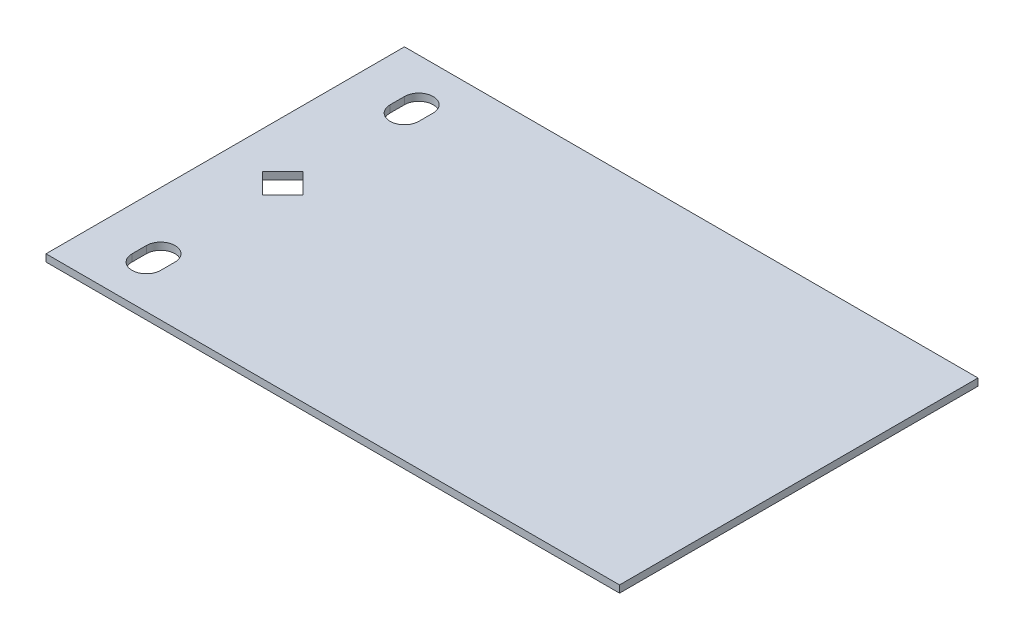
ISO-10303-21;
HEADER;
FILE_DESCRIPTION(('STEP AP214'),'2;1');
FILE_NAME('part.step','',(''),(''),'','','');
FILE_SCHEMA(('AUTOMOTIVE_DESIGN { 1 0 10303 214 1 1 1 1 }'));
ENDSEC;
DATA;
#1=APPLICATION_CONTEXT('core data for automotive mechanical design processes');
#2=APPLICATION_PROTOCOL_DEFINITION('international standard','automotive_design',2000,#1);
#3=PRODUCT_CONTEXT('',#1,'mechanical');
#4=PRODUCT('Part','Part','',(#3));
#5=PRODUCT_RELATED_PRODUCT_CATEGORY('part','',(#4));
#6=PRODUCT_DEFINITION_FORMATION('','',#4);
#7=PRODUCT_DEFINITION_CONTEXT('part definition',#1,'design');
#8=PRODUCT_DEFINITION('design','',#6,#7);
#9=PRODUCT_DEFINITION_SHAPE('','',#8);
#10=(LENGTH_UNIT() NAMED_UNIT(*) SI_UNIT(.MILLI.,.METRE.));
#11=(NAMED_UNIT(*) PLANE_ANGLE_UNIT() SI_UNIT($,.RADIAN.));
#12=(NAMED_UNIT(*) SI_UNIT($,.STERADIAN.) SOLID_ANGLE_UNIT());
#13=UNCERTAINTY_MEASURE_WITH_UNIT(LENGTH_MEASURE(1.E-05),#10,'distance_accuracy_value','');
#14=(GEOMETRIC_REPRESENTATION_CONTEXT(3) GLOBAL_UNCERTAINTY_ASSIGNED_CONTEXT((#13)) GLOBAL_UNIT_ASSIGNED_CONTEXT((#10,
#11,#12)) REPRESENTATION_CONTEXT('',''));
#15=CARTESIAN_POINT('',(0.,0.,0.));
#16=DIRECTION('',(0.,0.,1.));
#17=DIRECTION('',(1.,0.,0.));
#18=AXIS2_PLACEMENT_3D('',#15,#16,#17);
#19=CARTESIAN_POINT('',(0.,1.,0.));
#20=DIRECTION('',(0.,-1.,0.));
#21=DIRECTION('',(0.,0.,-1.));
#22=AXIS2_PLACEMENT_3D('',#19,#20,#21);
#23=PLANE('',#22);
#24=CARTESIAN_POINT('',(-32.,1.,19.));
#25=DIRECTION('',(0.,1.,0.));
#26=DIRECTION('',(0.,0.,1.));
#27=AXIS2_PLACEMENT_3D('',#24,#25,#26);
#28=CIRCLE('',#27,2.);
#29=CARTESIAN_POINT('',(-34.,1.,19.));
#30=VERTEX_POINT('',#29);
#31=CARTESIAN_POINT('',(-30.,1.,19.));
#32=VERTEX_POINT('',#31);
#33=EDGE_CURVE('E185',#30,#32,#28,.T.);
#34=ORIENTED_EDGE('',*,*,#33,.F.);
#35=DIRECTION('',(0.,0.,1.));
#36=VECTOR('',#35,1.);
#37=CARTESIAN_POINT('',(-34.,1.,19.));
#38=LINE('',#37,#36);
#39=CARTESIAN_POINT('',(-34.,1.,17.));
#40=VERTEX_POINT('',#39);
#41=EDGE_CURVE('E193',#40,#30,#38,.T.);
#42=ORIENTED_EDGE('',*,*,#41,.F.);
#43=CARTESIAN_POINT('',(-32.,1.,17.));
#44=DIRECTION('',(0.,1.,0.));
#45=DIRECTION('',(0.,0.,-1.));
#46=AXIS2_PLACEMENT_3D('',#43,#44,#45);
#47=CIRCLE('',#46,2.);
#48=CARTESIAN_POINT('',(-30.,1.,17.));
#49=VERTEX_POINT('',#48);
#50=EDGE_CURVE('E190',#49,#40,#47,.T.);
#51=ORIENTED_EDGE('',*,*,#50,.F.);
#52=DIRECTION('',(0.,0.,-1.));
#53=VECTOR('',#52,1.);
#54=CARTESIAN_POINT('',(-30.,1.,19.));
#55=LINE('',#54,#53);
#56=EDGE_CURVE('E187',#32,#49,#55,.T.);
#57=ORIENTED_EDGE('',*,*,#56,.F.);
#58=EDGE_LOOP('',(#34,#42,#51,#57));
#59=FACE_BOUND('',#58,.T.);
#60=DIRECTION('',(0.,0.,-1.));
#61=VECTOR('',#60,1.);
#62=CARTESIAN_POINT('',(40.,1.,25.));
#63=LINE('',#62,#61);
#64=CARTESIAN_POINT('',(40.,1.,25.));
#65=VERTEX_POINT('',#64);
#66=CARTESIAN_POINT('',(40.,1.,-25.));
#67=VERTEX_POINT('',#66);
#68=EDGE_CURVE('E247',#65,#67,#63,.T.);
#69=ORIENTED_EDGE('',*,*,#68,.T.);
#70=DIRECTION('',(-1.,0.,0.));
#71=VECTOR('',#70,1.);
#72=CARTESIAN_POINT('',(-40.,1.,-25.));
#73=LINE('',#72,#71);
#74=CARTESIAN_POINT('',(-40.,1.,-25.));
#75=VERTEX_POINT('',#74);
#76=EDGE_CURVE('E250',#67,#75,#73,.T.);
#77=ORIENTED_EDGE('',*,*,#76,.T.);
#78=DIRECTION('',(0.,0.,1.));
#79=VECTOR('',#78,1.);
#80=CARTESIAN_POINT('',(-40.,1.,25.));
#81=LINE('',#80,#79);
#82=CARTESIAN_POINT('',(-40.,1.,25.));
#83=VERTEX_POINT('',#82);
#84=EDGE_CURVE('E253',#75,#83,#81,.T.);
#85=ORIENTED_EDGE('',*,*,#84,.T.);
#86=DIRECTION('',(1.,0.,0.));
#87=VECTOR('',#86,1.);
#88=CARTESIAN_POINT('',(-40.,1.,25.));
#89=LINE('',#88,#87);
#90=EDGE_CURVE('E255',#83,#65,#89,.T.);
#91=ORIENTED_EDGE('',*,*,#90,.T.);
#92=EDGE_LOOP('',(#69,#77,#85,#91));
#93=FACE_BOUND('',#92,.T.);
#94=DIRECTION('',(-0.707106781186547,0.,0.707106781186548));
#95=VECTOR('',#94,1.);
#96=CARTESIAN_POINT('',(-32.,1.,-2.8284271247462));
#97=LINE('',#96,#95);
#98=CARTESIAN_POINT('',(-32.,1.,-2.8284271247462));
#99=VERTEX_POINT('',#98);
#100=CARTESIAN_POINT('',(-34.8284271247462,1.,0.));
#101=VERTEX_POINT('',#100);
#102=EDGE_CURVE('E216',#99,#101,#97,.T.);
#103=ORIENTED_EDGE('',*,*,#102,.F.);
#104=DIRECTION('',(-0.707106781186548,0.,-0.707106781186547));
#105=VECTOR('',#104,1.);
#106=CARTESIAN_POINT('',(-29.1715728752538,1.,0.));
#107=LINE('',#106,#105);
#108=CARTESIAN_POINT('',(-29.1715728752538,1.,0.));
#109=VERTEX_POINT('',#108);
#110=EDGE_CURVE('E224',#109,#99,#107,.T.);
#111=ORIENTED_EDGE('',*,*,#110,.F.);
#112=DIRECTION('',(0.707106781186548,0.,-0.707106781186547));
#113=VECTOR('',#112,1.);
#114=CARTESIAN_POINT('',(-32.,1.,2.82842712474619));
#115=LINE('',#114,#113);
#116=CARTESIAN_POINT('',(-32.,1.,2.82842712474619));
#117=VERTEX_POINT('',#116);
#118=EDGE_CURVE('E221',#117,#109,#115,.T.);
#119=ORIENTED_EDGE('',*,*,#118,.F.);
#120=DIRECTION('',(0.707106781186547,0.,0.707106781186548));
#121=VECTOR('',#120,1.);
#122=CARTESIAN_POINT('',(-34.8284271247462,1.,0.));
#123=LINE('',#122,#121);
#124=EDGE_CURVE('E218',#101,#117,#123,.T.);
#125=ORIENTED_EDGE('',*,*,#124,.F.);
#126=EDGE_LOOP('',(#103,#111,#119,#125));
#127=FACE_BOUND('',#126,.T.);
#128=CARTESIAN_POINT('',(-32.,1.,-19.));
#129=DIRECTION('',(0.,1.,0.));
#130=DIRECTION('',(0.,0.,-1.));
#131=AXIS2_PLACEMENT_3D('',#128,#129,#130);
#132=CIRCLE('',#131,2.);
#133=CARTESIAN_POINT('',(-30.,1.,-19.));
#134=VERTEX_POINT('',#133);
#135=CARTESIAN_POINT('',(-34.,1.,-19.));
#136=VERTEX_POINT('',#135);
#137=EDGE_CURVE('E149',#134,#136,#132,.T.);
#138=ORIENTED_EDGE('',*,*,#137,.F.);
#139=DIRECTION('',(0.,0.,-1.));
#140=VECTOR('',#139,1.);
#141=CARTESIAN_POINT('',(-30.,1.,-19.));
#142=LINE('',#141,#140);
#143=CARTESIAN_POINT('',(-30.,1.,-17.));
#144=VERTEX_POINT('',#143);
#145=EDGE_CURVE('E171',#144,#134,#142,.T.);
#146=ORIENTED_EDGE('',*,*,#145,.F.);
#147=CARTESIAN_POINT('',(-32.,1.,-17.));
#148=DIRECTION('',(0.,1.,0.));
#149=DIRECTION('',(0.,0.,1.));
#150=AXIS2_PLACEMENT_3D('',#147,#148,#149);
#151=CIRCLE('',#150,2.);
#152=CARTESIAN_POINT('',(-34.,1.,-17.));
#153=VERTEX_POINT('',#152);
#154=EDGE_CURVE('E169',#153,#144,#151,.T.);
#155=ORIENTED_EDGE('',*,*,#154,.F.);
#156=DIRECTION('',(0.,0.,1.));
#157=VECTOR('',#156,1.);
#158=CARTESIAN_POINT('',(-34.,1.,-19.));
#159=LINE('',#158,#157);
#160=EDGE_CURVE('E157',#136,#153,#159,.T.);
#161=ORIENTED_EDGE('',*,*,#160,.F.);
#162=EDGE_LOOP('',(#138,#146,#155,#161));
#163=FACE_BOUND('',#162,.T.);
#164=ADVANCED_FACE('F36',(#59,#93,#127,#163),#23,.F.);
#165=CARTESIAN_POINT('',(0.,0.,0.));
#166=DIRECTION('',(0.,-1.,0.));
#167=DIRECTION('',(0.,0.,-1.));
#168=AXIS2_PLACEMENT_3D('',#165,#166,#167);
#169=PLANE('',#168);
#170=DIRECTION('',(0.,0.,-1.));
#171=VECTOR('',#170,1.);
#172=CARTESIAN_POINT('',(40.,0.,25.));
#173=LINE('',#172,#171);
#174=CARTESIAN_POINT('',(40.,0.,25.));
#175=VERTEX_POINT('',#174);
#176=CARTESIAN_POINT('',(40.,0.,-25.));
#177=VERTEX_POINT('',#176);
#178=EDGE_CURVE('E246',#175,#177,#173,.T.);
#179=ORIENTED_EDGE('',*,*,#178,.F.);
#180=DIRECTION('',(1.,0.,0.));
#181=VECTOR('',#180,1.);
#182=CARTESIAN_POINT('',(-40.,0.,25.));
#183=LINE('',#182,#181);
#184=CARTESIAN_POINT('',(-40.,0.,25.));
#185=VERTEX_POINT('',#184);
#186=EDGE_CURVE('E251',#185,#175,#183,.T.);
#187=ORIENTED_EDGE('',*,*,#186,.F.);
#188=DIRECTION('',(0.,0.,1.));
#189=VECTOR('',#188,1.);
#190=CARTESIAN_POINT('',(-40.,0.,25.));
#191=LINE('',#190,#189);
#192=CARTESIAN_POINT('',(-40.,0.,-25.));
#193=VERTEX_POINT('',#192);
#194=EDGE_CURVE('E262',#193,#185,#191,.T.);
#195=ORIENTED_EDGE('',*,*,#194,.F.);
#196=DIRECTION('',(-1.,0.,0.));
#197=VECTOR('',#196,1.);
#198=CARTESIAN_POINT('',(-40.,0.,-25.));
#199=LINE('',#198,#197);
#200=EDGE_CURVE('E260',#177,#193,#199,.T.);
#201=ORIENTED_EDGE('',*,*,#200,.F.);
#202=EDGE_LOOP('',(#179,#187,#195,#201));
#203=FACE_BOUND('',#202,.T.);
#204=DIRECTION('',(-0.707106781186548,0.,-0.707106781186547));
#205=VECTOR('',#204,1.);
#206=CARTESIAN_POINT('',(-29.1715728752538,0.,0.));
#207=LINE('',#206,#205);
#208=CARTESIAN_POINT('',(-29.1715728752538,0.,0.));
#209=VERTEX_POINT('',#208);
#210=CARTESIAN_POINT('',(-32.,0.,-2.82842712474619));
#211=VERTEX_POINT('',#210);
#212=EDGE_CURVE('E219',#209,#211,#207,.T.);
#213=ORIENTED_EDGE('',*,*,#212,.T.);
#214=DIRECTION('',(-0.707106781186547,0.,0.707106781186548));
#215=VECTOR('',#214,1.);
#216=CARTESIAN_POINT('',(-32.,0.,-2.8284271247462));
#217=LINE('',#216,#215);
#218=CARTESIAN_POINT('',(-34.8284271247462,0.,0.));
#219=VERTEX_POINT('',#218);
#220=EDGE_CURVE('E215',#211,#219,#217,.T.);
#221=ORIENTED_EDGE('',*,*,#220,.T.);
#222=DIRECTION('',(0.707106781186547,0.,0.707106781186548));
#223=VECTOR('',#222,1.);
#224=CARTESIAN_POINT('',(-34.8284271247462,0.,0.));
#225=LINE('',#224,#223);
#226=CARTESIAN_POINT('',(-32.,0.,2.82842712474619));
#227=VERTEX_POINT('',#226);
#228=EDGE_CURVE('E229',#219,#227,#225,.T.);
#229=ORIENTED_EDGE('',*,*,#228,.T.);
#230=DIRECTION('',(0.707106781186548,0.,-0.707106781186547));
#231=VECTOR('',#230,1.);
#232=CARTESIAN_POINT('',(-32.,0.,2.82842712474619));
#233=LINE('',#232,#231);
#234=EDGE_CURVE('E232',#227,#209,#233,.T.);
#235=ORIENTED_EDGE('',*,*,#234,.T.);
#236=EDGE_LOOP('',(#213,#221,#229,#235));
#237=FACE_BOUND('',#236,.T.);
#238=DIRECTION('',(0.,0.,1.));
#239=VECTOR('',#238,1.);
#240=CARTESIAN_POINT('',(-34.,0.,19.));
#241=LINE('',#240,#239);
#242=CARTESIAN_POINT('',(-34.,0.,17.));
#243=VERTEX_POINT('',#242);
#244=CARTESIAN_POINT('',(-34.,0.,19.));
#245=VERTEX_POINT('',#244);
#246=EDGE_CURVE('E188',#243,#245,#241,.T.);
#247=ORIENTED_EDGE('',*,*,#246,.T.);
#248=CARTESIAN_POINT('',(-32.,0.,19.));
#249=DIRECTION('',(0.,1.,0.));
#250=DIRECTION('',(0.,0.,1.));
#251=AXIS2_PLACEMENT_3D('',#248,#249,#250);
#252=CIRCLE('',#251,2.);
#253=CARTESIAN_POINT('',(-30.,0.,19.));
#254=VERTEX_POINT('',#253);
#255=EDGE_CURVE('E165',#245,#254,#252,.T.);
#256=ORIENTED_EDGE('',*,*,#255,.T.);
#257=DIRECTION('',(0.,0.,-1.));
#258=VECTOR('',#257,1.);
#259=CARTESIAN_POINT('',(-30.,0.,19.));
#260=LINE('',#259,#258);
#261=CARTESIAN_POINT('',(-30.,0.,17.));
#262=VERTEX_POINT('',#261);
#263=EDGE_CURVE('E198',#254,#262,#260,.T.);
#264=ORIENTED_EDGE('',*,*,#263,.T.);
#265=CARTESIAN_POINT('',(-32.,0.,17.));
#266=DIRECTION('',(0.,1.,0.));
#267=DIRECTION('',(0.,0.,-1.));
#268=AXIS2_PLACEMENT_3D('',#265,#266,#267);
#269=CIRCLE('',#268,2.);
#270=EDGE_CURVE('E201',#262,#243,#269,.T.);
#271=ORIENTED_EDGE('',*,*,#270,.T.);
#272=EDGE_LOOP('',(#247,#256,#264,#271));
#273=FACE_BOUND('',#272,.T.);
#274=DIRECTION('',(0.,0.,-1.));
#275=VECTOR('',#274,1.);
#276=CARTESIAN_POINT('',(-30.,0.,-19.));
#277=LINE('',#276,#275);
#278=CARTESIAN_POINT('',(-30.,0.,-17.));
#279=VERTEX_POINT('',#278);
#280=CARTESIAN_POINT('',(-30.,0.,-19.));
#281=VERTEX_POINT('',#280);
#282=EDGE_CURVE('E158',#279,#281,#277,.T.);
#283=ORIENTED_EDGE('',*,*,#282,.T.);
#284=CARTESIAN_POINT('',(-32.,0.,-19.));
#285=DIRECTION('',(0.,1.,0.));
#286=DIRECTION('',(0.,0.,-1.));
#287=AXIS2_PLACEMENT_3D('',#284,#285,#286);
#288=CIRCLE('',#287,2.);
#289=CARTESIAN_POINT('',(-34.,0.,-19.));
#290=VERTEX_POINT('',#289);
#291=EDGE_CURVE('E59',#281,#290,#288,.T.);
#292=ORIENTED_EDGE('',*,*,#291,.T.);
#293=DIRECTION('',(0.,0.,1.));
#294=VECTOR('',#293,1.);
#295=CARTESIAN_POINT('',(-34.,0.,-19.));
#296=LINE('',#295,#294);
#297=CARTESIAN_POINT('',(-34.,0.,-17.));
#298=VERTEX_POINT('',#297);
#299=EDGE_CURVE('E164',#290,#298,#296,.T.);
#300=ORIENTED_EDGE('',*,*,#299,.T.);
#301=CARTESIAN_POINT('',(-32.,0.,-17.));
#302=DIRECTION('',(0.,1.,0.));
#303=DIRECTION('',(0.,0.,1.));
#304=AXIS2_PLACEMENT_3D('',#301,#302,#303);
#305=CIRCLE('',#304,2.);
#306=EDGE_CURVE('E177',#298,#279,#305,.T.);
#307=ORIENTED_EDGE('',*,*,#306,.T.);
#308=EDGE_LOOP('',(#283,#292,#300,#307));
#309=FACE_BOUND('',#308,.T.);
#310=ADVANCED_FACE('F280',(#203,#237,#273,#309),#169,.T.);
#311=CARTESIAN_POINT('',(40.,1.,25.));
#312=DIRECTION('',(-1.,0.,0.));
#313=DIRECTION('',(0.,0.,1.));
#314=AXIS2_PLACEMENT_3D('',#311,#312,#313);
#315=PLANE('',#314);
#316=ORIENTED_EDGE('',*,*,#178,.T.);
#317=DIRECTION('',(0.,-1.,0.));
#318=VECTOR('',#317,1.);
#319=CARTESIAN_POINT('',(40.,1.,-25.));
#320=LINE('',#319,#318);
#321=EDGE_CURVE('E11',#67,#177,#320,.T.);
#322=ORIENTED_EDGE('',*,*,#321,.F.);
#323=ORIENTED_EDGE('',*,*,#68,.F.);
#324=DIRECTION('',(0.,-1.,0.));
#325=VECTOR('',#324,1.);
#326=CARTESIAN_POINT('',(40.,1.,25.));
#327=LINE('',#326,#325);
#328=EDGE_CURVE('E257',#65,#175,#327,.T.);
#329=ORIENTED_EDGE('',*,*,#328,.T.);
#330=EDGE_LOOP('',(#316,#322,#323,#329));
#331=FACE_BOUND('',#330,.T.);
#332=ADVANCED_FACE('F38',(#331),#315,.F.);
#333=CARTESIAN_POINT('',(-40.,1.,-25.));
#334=DIRECTION('',(0.,0.,1.));
#335=DIRECTION('',(1.,0.,0.));
#336=AXIS2_PLACEMENT_3D('',#333,#334,#335);
#337=PLANE('',#336);
#338=ORIENTED_EDGE('',*,*,#200,.T.);
#339=DIRECTION('',(0.,-1.,0.));
#340=VECTOR('',#339,1.);
#341=CARTESIAN_POINT('',(-40.,1.,-25.));
#342=LINE('',#341,#340);
#343=EDGE_CURVE('E44',#75,#193,#342,.T.);
#344=ORIENTED_EDGE('',*,*,#343,.F.);
#345=ORIENTED_EDGE('',*,*,#76,.F.);
#346=ORIENTED_EDGE('',*,*,#321,.T.);
#347=EDGE_LOOP('',(#338,#344,#345,#346));
#348=FACE_BOUND('',#347,.T.);
#349=ADVANCED_FACE('F291',(#348),#337,.F.);
#350=CARTESIAN_POINT('',(-40.,1.,25.));
#351=DIRECTION('',(1.,0.,0.));
#352=DIRECTION('',(0.,0.,-1.));
#353=AXIS2_PLACEMENT_3D('',#350,#351,#352);
#354=PLANE('',#353);
#355=ORIENTED_EDGE('',*,*,#194,.T.);
#356=DIRECTION('',(0.,-1.,0.));
#357=VECTOR('',#356,1.);
#358=CARTESIAN_POINT('',(-40.,1.,25.));
#359=LINE('',#358,#357);
#360=EDGE_CURVE('E267',#83,#185,#359,.T.);
#361=ORIENTED_EDGE('',*,*,#360,.F.);
#362=ORIENTED_EDGE('',*,*,#84,.F.);
#363=ORIENTED_EDGE('',*,*,#343,.T.);
#364=EDGE_LOOP('',(#355,#361,#362,#363));
#365=FACE_BOUND('',#364,.T.);
#366=ADVANCED_FACE('F274',(#365),#354,.F.);
#367=CARTESIAN_POINT('',(-40.,1.,25.));
#368=DIRECTION('',(0.,0.,-1.));
#369=DIRECTION('',(-1.,0.,0.));
#370=AXIS2_PLACEMENT_3D('',#367,#368,#369);
#371=PLANE('',#370);
#372=ORIENTED_EDGE('',*,*,#186,.T.);
#373=ORIENTED_EDGE('',*,*,#328,.F.);
#374=ORIENTED_EDGE('',*,*,#90,.F.);
#375=ORIENTED_EDGE('',*,*,#360,.T.);
#376=EDGE_LOOP('',(#372,#373,#374,#375));
#377=FACE_BOUND('',#376,.T.);
#378=ADVANCED_FACE('F284',(#377),#371,.F.);
#379=CARTESIAN_POINT('',(-32.,1.,-2.8284271247462));
#380=DIRECTION('',(0.707106781186548,0.,0.707106781186547));
#381=DIRECTION('',(0.707106781186547,0.,-0.707106781186548));
#382=AXIS2_PLACEMENT_3D('',#379,#380,#381);
#383=PLANE('',#382);
#384=ORIENTED_EDGE('',*,*,#220,.F.);
#385=DIRECTION('',(0.,-1.,0.));
#386=VECTOR('',#385,1.);
#387=CARTESIAN_POINT('',(-32.,1.,-2.8284271247462));
#388=LINE('',#387,#386);
#389=EDGE_CURVE('E226',#99,#211,#388,.T.);
#390=ORIENTED_EDGE('',*,*,#389,.F.);
#391=ORIENTED_EDGE('',*,*,#102,.T.);
#392=DIRECTION('',(0.,-1.,0.));
#393=VECTOR('',#392,1.);
#394=CARTESIAN_POINT('',(-34.8284271247462,1.,0.));
#395=LINE('',#394,#393);
#396=EDGE_CURVE('E243',#101,#219,#395,.T.);
#397=ORIENTED_EDGE('',*,*,#396,.T.);
#398=EDGE_LOOP('',(#384,#390,#391,#397));
#399=FACE_BOUND('',#398,.T.);
#400=ADVANCED_FACE('F307',(#399),#383,.T.);
#401=CARTESIAN_POINT('',(-34.8284271247462,1.,0.));
#402=DIRECTION('',(0.707106781186548,0.,-0.707106781186547));
#403=DIRECTION('',(-0.707106781186547,0.,-0.707106781186548));
#404=AXIS2_PLACEMENT_3D('',#401,#402,#403);
#405=PLANE('',#404);
#406=ORIENTED_EDGE('',*,*,#228,.F.);
#407=ORIENTED_EDGE('',*,*,#396,.F.);
#408=ORIENTED_EDGE('',*,*,#124,.T.);
#409=DIRECTION('',(0.,-1.,0.));
#410=VECTOR('',#409,1.);
#411=CARTESIAN_POINT('',(-32.,1.,2.82842712474619));
#412=LINE('',#411,#410);
#413=EDGE_CURVE('E241',#117,#227,#412,.T.);
#414=ORIENTED_EDGE('',*,*,#413,.T.);
#415=EDGE_LOOP('',(#406,#407,#408,#414));
#416=FACE_BOUND('',#415,.T.);
#417=ADVANCED_FACE('F314',(#416),#405,.T.);
#418=CARTESIAN_POINT('',(-32.,1.,2.82842712474619));
#419=DIRECTION('',(-0.707106781186547,0.,-0.707106781186548));
#420=DIRECTION('',(-0.707106781186548,0.,0.707106781186547));
#421=AXIS2_PLACEMENT_3D('',#418,#419,#420);
#422=PLANE('',#421);
#423=ORIENTED_EDGE('',*,*,#234,.F.);
#424=ORIENTED_EDGE('',*,*,#413,.F.);
#425=ORIENTED_EDGE('',*,*,#118,.T.);
#426=DIRECTION('',(0.,-1.,0.));
#427=VECTOR('',#426,1.);
#428=CARTESIAN_POINT('',(-29.1715728752538,1.,0.));
#429=LINE('',#428,#427);
#430=EDGE_CURVE('E239',#109,#209,#429,.T.);
#431=ORIENTED_EDGE('',*,*,#430,.T.);
#432=EDGE_LOOP('',(#423,#424,#425,#431));
#433=FACE_BOUND('',#432,.T.);
#434=ADVANCED_FACE('F319',(#433),#422,.T.);
#435=CARTESIAN_POINT('',(-29.1715728752538,1.,0.));
#436=DIRECTION('',(-0.707106781186547,0.,0.707106781186548));
#437=DIRECTION('',(0.707106781186548,0.,0.707106781186547));
#438=AXIS2_PLACEMENT_3D('',#435,#436,#437);
#439=PLANE('',#438);
#440=ORIENTED_EDGE('',*,*,#212,.F.);
#441=ORIENTED_EDGE('',*,*,#430,.F.);
#442=ORIENTED_EDGE('',*,*,#110,.T.);
#443=ORIENTED_EDGE('',*,*,#389,.T.);
#444=EDGE_LOOP('',(#440,#441,#442,#443));
#445=FACE_BOUND('',#444,.T.);
#446=ADVANCED_FACE('F326',(#445),#439,.T.);
#447=CARTESIAN_POINT('',(-32.,1.,19.));
#448=DIRECTION('',(0.,-1.,0.));
#449=DIRECTION('',(0.,0.,-1.));
#450=AXIS2_PLACEMENT_3D('',#447,#448,#449);
#451=CYLINDRICAL_SURFACE('',#450,2.);
#452=ORIENTED_EDGE('',*,*,#255,.F.);
#453=DIRECTION('',(0.,-1.,0.));
#454=VECTOR('',#453,1.);
#455=CARTESIAN_POINT('',(-34.,1.,19.));
#456=LINE('',#455,#454);
#457=EDGE_CURVE('E195',#30,#245,#456,.T.);
#458=ORIENTED_EDGE('',*,*,#457,.F.);
#459=ORIENTED_EDGE('',*,*,#33,.T.);
#460=DIRECTION('',(0.,-1.,0.));
#461=VECTOR('',#460,1.);
#462=CARTESIAN_POINT('',(-30.,1.,19.));
#463=LINE('',#462,#461);
#464=EDGE_CURVE('E212',#32,#254,#463,.T.);
#465=ORIENTED_EDGE('',*,*,#464,.T.);
#466=EDGE_LOOP('',(#452,#458,#459,#465));
#467=FACE_BOUND('',#466,.T.);
#468=ADVANCED_FACE('F339',(#467),#451,.F.);
#469=CARTESIAN_POINT('',(-30.,1.,19.));
#470=DIRECTION('',(-1.,0.,0.));
#471=DIRECTION('',(0.,0.,1.));
#472=AXIS2_PLACEMENT_3D('',#469,#470,#471);
#473=PLANE('',#472);
#474=ORIENTED_EDGE('',*,*,#263,.F.);
#475=ORIENTED_EDGE('',*,*,#464,.F.);
#476=ORIENTED_EDGE('',*,*,#56,.T.);
#477=DIRECTION('',(0.,-1.,0.));
#478=VECTOR('',#477,1.);
#479=CARTESIAN_POINT('',(-30.,1.,17.));
#480=LINE('',#479,#478);
#481=EDGE_CURVE('E210',#49,#262,#480,.T.);
#482=ORIENTED_EDGE('',*,*,#481,.T.);
#483=EDGE_LOOP('',(#474,#475,#476,#482));
#484=FACE_BOUND('',#483,.T.);
#485=ADVANCED_FACE('F344',(#484),#473,.T.);
#486=CARTESIAN_POINT('',(-32.,1.,17.));
#487=DIRECTION('',(0.,-1.,0.));
#488=DIRECTION('',(0.,0.,-1.));
#489=AXIS2_PLACEMENT_3D('',#486,#487,#488);
#490=CYLINDRICAL_SURFACE('',#489,2.);
#491=ORIENTED_EDGE('',*,*,#270,.F.);
#492=ORIENTED_EDGE('',*,*,#481,.F.);
#493=ORIENTED_EDGE('',*,*,#50,.T.);
#494=DIRECTION('',(0.,-1.,0.));
#495=VECTOR('',#494,1.);
#496=CARTESIAN_POINT('',(-34.,1.,17.));
#497=LINE('',#496,#495);
#498=EDGE_CURVE('E208',#40,#243,#497,.T.);
#499=ORIENTED_EDGE('',*,*,#498,.T.);
#500=EDGE_LOOP('',(#491,#492,#493,#499));
#501=FACE_BOUND('',#500,.T.);
#502=ADVANCED_FACE('F348',(#501),#490,.F.);
#503=CARTESIAN_POINT('',(-34.,1.,19.));
#504=DIRECTION('',(1.,0.,0.));
#505=DIRECTION('',(0.,0.,-1.));
#506=AXIS2_PLACEMENT_3D('',#503,#504,#505);
#507=PLANE('',#506);
#508=ORIENTED_EDGE('',*,*,#246,.F.);
#509=ORIENTED_EDGE('',*,*,#498,.F.);
#510=ORIENTED_EDGE('',*,*,#41,.T.);
#511=ORIENTED_EDGE('',*,*,#457,.T.);
#512=EDGE_LOOP('',(#508,#509,#510,#511));
#513=FACE_BOUND('',#512,.T.);
#514=ADVANCED_FACE('F352',(#513),#507,.T.);
#515=CARTESIAN_POINT('',(-32.,1.,-19.));
#516=DIRECTION('',(0.,-1.,0.));
#517=DIRECTION('',(0.,0.,-1.));
#518=AXIS2_PLACEMENT_3D('',#515,#516,#517);
#519=CYLINDRICAL_SURFACE('',#518,2.);
#520=ORIENTED_EDGE('',*,*,#291,.F.);
#521=DIRECTION('',(0.,-1.,0.));
#522=VECTOR('',#521,1.);
#523=CARTESIAN_POINT('',(-30.,1.,-19.));
#524=LINE('',#523,#522);
#525=EDGE_CURVE('E153',#134,#281,#524,.T.);
#526=ORIENTED_EDGE('',*,*,#525,.F.);
#527=ORIENTED_EDGE('',*,*,#137,.T.);
#528=DIRECTION('',(0.,-1.,0.));
#529=VECTOR('',#528,1.);
#530=CARTESIAN_POINT('',(-34.,1.,-19.));
#531=LINE('',#530,#529);
#532=EDGE_CURVE('E152',#136,#290,#531,.T.);
#533=ORIENTED_EDGE('',*,*,#532,.T.);
#534=EDGE_LOOP('',(#520,#526,#527,#533));
#535=FACE_BOUND('',#534,.T.);
#536=ADVANCED_FACE('F151',(#535),#519,.F.);
#537=CARTESIAN_POINT('',(-34.,1.,-19.));
#538=DIRECTION('',(1.,0.,0.));
#539=DIRECTION('',(0.,0.,-1.));
#540=AXIS2_PLACEMENT_3D('',#537,#538,#539);
#541=PLANE('',#540);
#542=ORIENTED_EDGE('',*,*,#299,.F.);
#543=ORIENTED_EDGE('',*,*,#532,.F.);
#544=ORIENTED_EDGE('',*,*,#160,.T.);
#545=DIRECTION('',(0.,-1.,0.));
#546=VECTOR('',#545,1.);
#547=CARTESIAN_POINT('',(-34.,1.,-17.));
#548=LINE('',#547,#546);
#549=EDGE_CURVE('E166',#153,#298,#548,.T.);
#550=ORIENTED_EDGE('',*,*,#549,.T.);
#551=EDGE_LOOP('',(#542,#543,#544,#550));
#552=FACE_BOUND('',#551,.T.);
#553=ADVANCED_FACE('F161',(#552),#541,.T.);
#554=CARTESIAN_POINT('',(-32.,1.,-17.));
#555=DIRECTION('',(0.,-1.,0.));
#556=DIRECTION('',(0.,0.,-1.));
#557=AXIS2_PLACEMENT_3D('',#554,#555,#556);
#558=CYLINDRICAL_SURFACE('',#557,2.);
#559=ORIENTED_EDGE('',*,*,#306,.F.);
#560=ORIENTED_EDGE('',*,*,#549,.F.);
#561=ORIENTED_EDGE('',*,*,#154,.T.);
#562=DIRECTION('',(0.,-1.,0.));
#563=VECTOR('',#562,1.);
#564=CARTESIAN_POINT('',(-30.,1.,-17.));
#565=LINE('',#564,#563);
#566=EDGE_CURVE('E51',#144,#279,#565,.T.);
#567=ORIENTED_EDGE('',*,*,#566,.T.);
#568=EDGE_LOOP('',(#559,#560,#561,#567));
#569=FACE_BOUND('',#568,.T.);
#570=ADVANCED_FACE('F361',(#569),#558,.F.);
#571=CARTESIAN_POINT('',(-30.,1.,-19.));
#572=DIRECTION('',(-1.,0.,0.));
#573=DIRECTION('',(0.,0.,1.));
#574=AXIS2_PLACEMENT_3D('',#571,#572,#573);
#575=PLANE('',#574);
#576=ORIENTED_EDGE('',*,*,#282,.F.);
#577=ORIENTED_EDGE('',*,*,#566,.F.);
#578=ORIENTED_EDGE('',*,*,#145,.T.);
#579=ORIENTED_EDGE('',*,*,#525,.T.);
#580=EDGE_LOOP('',(#576,#577,#578,#579));
#581=FACE_BOUND('',#580,.T.);
#582=ADVANCED_FACE('F364',(#581),#575,.T.);
#583=CLOSED_SHELL('',(#164,#310,#332,#349,#366,#378,#400,#417,#434,#446,#468,#485,#502,#514,
#536,#553,#570,#582));
#584=MANIFOLD_SOLID_BREP('B2',#583);
#585=ADVANCED_BREP_SHAPE_REPRESENTATION('',(#18,#584),#14);
#586=SHAPE_DEFINITION_REPRESENTATION(#9,#585);
ENDSEC;
END-ISO-10303-21;
